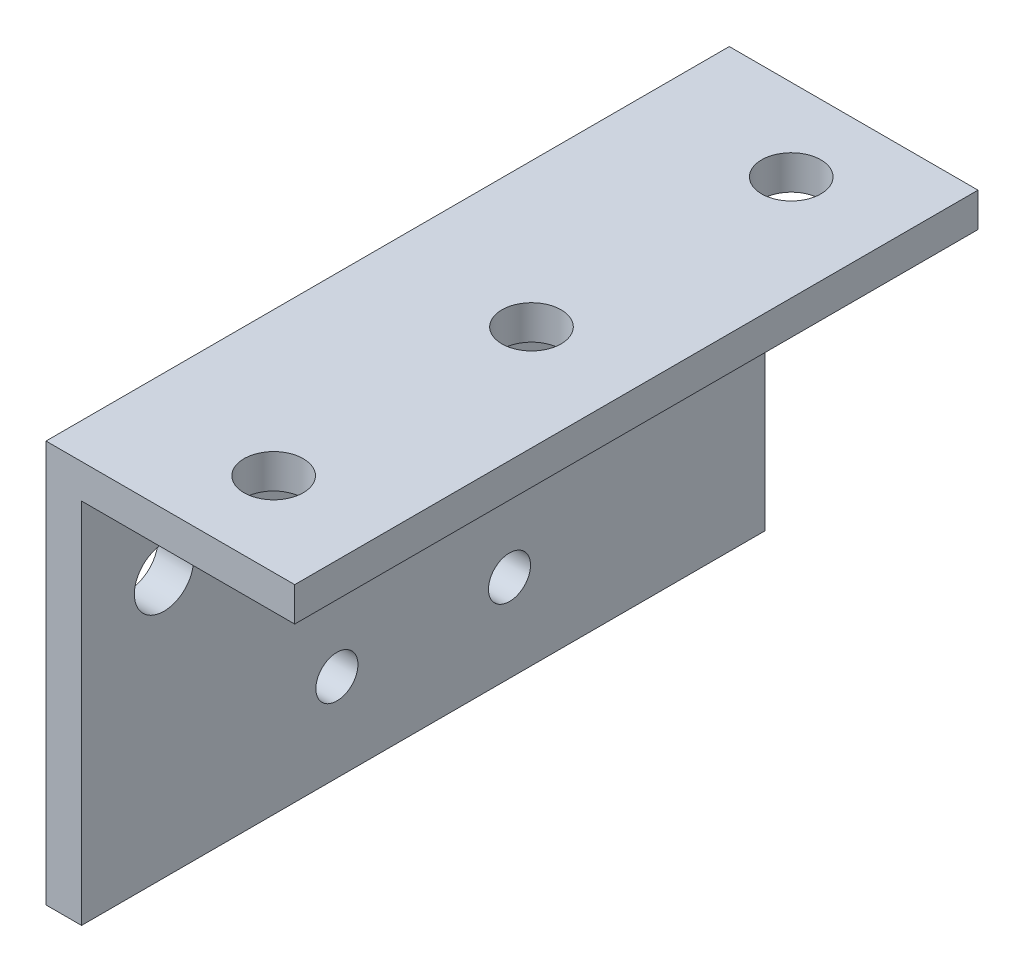
ISO-10303-21;
HEADER;
FILE_DESCRIPTION(('STEP AP214'),'2;1');
FILE_NAME('part.step','',(''),(''),'','','');
FILE_SCHEMA(('AUTOMOTIVE_DESIGN { 1 0 10303 214 1 1 1 1 }'));
ENDSEC;
DATA;
#1=APPLICATION_CONTEXT('core data for automotive mechanical design processes');
#2=APPLICATION_PROTOCOL_DEFINITION('international standard','automotive_design',2000,#1);
#3=PRODUCT_CONTEXT('',#1,'mechanical');
#4=PRODUCT('Part','Part','',(#3));
#5=PRODUCT_RELATED_PRODUCT_CATEGORY('part','',(#4));
#6=PRODUCT_DEFINITION_FORMATION('','',#4);
#7=PRODUCT_DEFINITION_CONTEXT('part definition',#1,'design');
#8=PRODUCT_DEFINITION('design','',#6,#7);
#9=PRODUCT_DEFINITION_SHAPE('','',#8);
#10=(LENGTH_UNIT() NAMED_UNIT(*) SI_UNIT(.MILLI.,.METRE.));
#11=(NAMED_UNIT(*) PLANE_ANGLE_UNIT() SI_UNIT($,.RADIAN.));
#12=(NAMED_UNIT(*) SI_UNIT($,.STERADIAN.) SOLID_ANGLE_UNIT());
#13=UNCERTAINTY_MEASURE_WITH_UNIT(LENGTH_MEASURE(1.E-05),#10,'distance_accuracy_value','');
#14=(GEOMETRIC_REPRESENTATION_CONTEXT(3) GLOBAL_UNCERTAINTY_ASSIGNED_CONTEXT((#13)) GLOBAL_UNIT_ASSIGNED_CONTEXT((#10,
#11,#12)) REPRESENTATION_CONTEXT('',''));
#15=CARTESIAN_POINT('',(0.,0.,0.));
#16=DIRECTION('',(0.,0.,1.));
#17=DIRECTION('',(1.,0.,0.));
#18=AXIS2_PLACEMENT_3D('',#15,#16,#17);
#19=CARTESIAN_POINT('',(0.,0.,63.5));
#20=DIRECTION('',(0.,1.,0.));
#21=DIRECTION('',(0.,0.,1.));
#22=AXIS2_PLACEMENT_3D('',#19,#20,#21);
#23=PLANE('',#22);
#24=DIRECTION('',(1.,0.,0.));
#25=VECTOR('',#24,1.);
#26=CARTESIAN_POINT('',(0.,0.,0.));
#27=LINE('',#26,#25);
#28=CARTESIAN_POINT('',(0.,0.,0.));
#29=VERTEX_POINT('',#28);
#30=CARTESIAN_POINT('',(3.302,0.,0.));
#31=VERTEX_POINT('',#30);
#32=EDGE_CURVE('E126',#29,#31,#27,.T.);
#33=ORIENTED_EDGE('',*,*,#32,.T.);
#34=DIRECTION('',(0.,0.,-1.));
#35=VECTOR('',#34,1.);
#36=CARTESIAN_POINT('',(3.302,0.,63.5));
#37=LINE('',#36,#35);
#38=CARTESIAN_POINT('',(3.302,0.,63.5));
#39=VERTEX_POINT('',#38);
#40=EDGE_CURVE('E11',#39,#31,#37,.T.);
#41=ORIENTED_EDGE('',*,*,#40,.F.);
#42=DIRECTION('',(1.,0.,0.));
#43=VECTOR('',#42,1.);
#44=CARTESIAN_POINT('',(0.,0.,63.5));
#45=LINE('',#44,#43);
#46=CARTESIAN_POINT('',(0.,0.,63.5));
#47=VERTEX_POINT('',#46);
#48=EDGE_CURVE('E137',#47,#39,#45,.T.);
#49=ORIENTED_EDGE('',*,*,#48,.F.);
#50=DIRECTION('',(0.,0.,-1.));
#51=VECTOR('',#50,1.);
#52=CARTESIAN_POINT('',(0.,0.,63.5));
#53=LINE('',#52,#51);
#54=EDGE_CURVE('E122',#47,#29,#53,.T.);
#55=ORIENTED_EDGE('',*,*,#54,.T.);
#56=EDGE_LOOP('',(#33,#41,#49,#55));
#57=FACE_BOUND('',#56,.T.);
#58=ADVANCED_FACE('F40',(#57),#23,.F.);
#59=CARTESIAN_POINT('',(3.302,0.,63.5));
#60=DIRECTION('',(-1.,0.,0.));
#61=DIRECTION('',(0.,0.,1.));
#62=AXIS2_PLACEMENT_3D('',#59,#60,#61);
#63=PLANE('',#62);
#64=CARTESIAN_POINT('',(3.302,8.16153330445288,39.7679614450534));
#65=DIRECTION('',(-1.,0.,0.));
#66=DIRECTION('',(0.,0.,1.));
#67=AXIS2_PLACEMENT_3D('',#64,#65,#66);
#68=CIRCLE('',#67,1.95579999999999);
#69=CARTESIAN_POINT('',(3.302,8.16153330445288,41.7237614450534));
#70=VERTEX_POINT('',#69);
#71=EDGE_CURVE('E411',#70,#70,#68,.T.);
#72=ORIENTED_EDGE('',*,*,#71,.T.);
#73=EDGE_LOOP('',(#72));
#74=FACE_BOUND('',#73,.T.);
#75=CARTESIAN_POINT('',(3.302,8.1423547735249,23.726603660302));
#76=DIRECTION('',(-1.,0.,0.));
#77=DIRECTION('',(0.,0.,1.));
#78=AXIS2_PLACEMENT_3D('',#75,#76,#77);
#79=CIRCLE('',#78,1.95579999999999);
#80=CARTESIAN_POINT('',(3.302,8.1423547735249,25.682403660302));
#81=VERTEX_POINT('',#80);
#82=EDGE_CURVE('E43',#81,#81,#79,.T.);
#83=ORIENTED_EDGE('',*,*,#82,.T.);
#84=EDGE_LOOP('',(#83));
#85=FACE_BOUND('',#84,.T.);
#86=CARTESIAN_POINT('',(3.302,24.1475733585337,23.726603660302));
#87=DIRECTION('',(-1.,0.,0.));
#88=DIRECTION('',(0.,0.,1.));
#89=AXIS2_PLACEMENT_3D('',#86,#87,#88);
#90=CIRCLE('',#89,1.95579999999999);
#91=CARTESIAN_POINT('',(3.302,24.1475733585337,25.682403660302));
#92=VERTEX_POINT('',#91);
#93=EDGE_CURVE('E401',#92,#92,#90,.T.);
#94=ORIENTED_EDGE('',*,*,#93,.T.);
#95=EDGE_LOOP('',(#94));
#96=FACE_BOUND('',#95,.T.);
#97=CARTESIAN_POINT('',(3.302,24.1475733585337,39.7207789537417));
#98=DIRECTION('',(-1.,0.,0.));
#99=DIRECTION('',(0.,0.,1.));
#100=AXIS2_PLACEMENT_3D('',#97,#98,#99);
#101=CIRCLE('',#100,1.95579999999999);
#102=CARTESIAN_POINT('',(3.302,24.1475733585337,41.6765789537417));
#103=VERTEX_POINT('',#102);
#104=EDGE_CURVE('E152',#103,#103,#101,.T.);
#105=ORIENTED_EDGE('',*,*,#104,.T.);
#106=EDGE_LOOP('',(#105));
#107=FACE_BOUND('',#106,.T.);
#108=CARTESIAN_POINT('',(3.302,24.2082215193958,7.6776384833819));
#109=DIRECTION('',(-1.,0.,0.));
#110=DIRECTION('',(0.,0.,1.));
#111=AXIS2_PLACEMENT_3D('',#108,#109,#110);
#112=CIRCLE('',#111,2.75);
#113=CARTESIAN_POINT('',(3.302,24.2082215193958,10.4276384833819));
#114=VERTEX_POINT('',#113);
#115=EDGE_CURVE('E166',#114,#114,#112,.T.);
#116=ORIENTED_EDGE('',*,*,#115,.T.);
#117=EDGE_LOOP('',(#116));
#118=FACE_BOUND('',#117,.T.);
#119=CARTESIAN_POINT('',(3.302,24.2082215193958,55.8413474799005));
#120=DIRECTION('',(-1.,0.,0.));
#121=DIRECTION('',(0.,0.,1.));
#122=AXIS2_PLACEMENT_3D('',#119,#120,#121);
#123=CIRCLE('',#122,2.75);
#124=CARTESIAN_POINT('',(3.302,24.2082215193958,58.5913474799005));
#125=VERTEX_POINT('',#124);
#126=EDGE_CURVE('E130',#125,#125,#123,.T.);
#127=ORIENTED_EDGE('',*,*,#126,.T.);
#128=EDGE_LOOP('',(#127));
#129=FACE_BOUND('',#128,.T.);
#130=DIRECTION('',(0.,1.,0.));
#131=VECTOR('',#130,1.);
#132=CARTESIAN_POINT('',(3.302,0.,0.));
#133=LINE('',#132,#131);
#134=CARTESIAN_POINT('',(3.302,34.163,0.));
#135=VERTEX_POINT('',#134);
#136=EDGE_CURVE('E129',#31,#135,#133,.T.);
#137=ORIENTED_EDGE('',*,*,#136,.T.);
#138=DIRECTION('',(0.,0.,-1.));
#139=VECTOR('',#138,1.);
#140=CARTESIAN_POINT('',(3.302,34.163,63.5));
#141=LINE('',#140,#139);
#142=CARTESIAN_POINT('',(3.302,34.163,63.5));
#143=VERTEX_POINT('',#142);
#144=EDGE_CURVE('E49',#143,#135,#141,.T.);
#145=ORIENTED_EDGE('',*,*,#144,.F.);
#146=DIRECTION('',(0.,1.,0.));
#147=VECTOR('',#146,1.);
#148=CARTESIAN_POINT('',(3.302,0.,63.5));
#149=LINE('',#148,#147);
#150=EDGE_CURVE('E95',#39,#143,#149,.T.);
#151=ORIENTED_EDGE('',*,*,#150,.F.);
#152=ORIENTED_EDGE('',*,*,#40,.T.);
#153=EDGE_LOOP('',(#137,#145,#151,#152));
#154=FACE_BOUND('',#153,.T.);
#155=ADVANCED_FACE('F177',(#74,#85,#96,#107,#118,#129,#154),#63,.F.);
#156=CARTESIAN_POINT('',(3.302,34.163,63.5));
#157=DIRECTION('',(0.,1.,0.));
#158=DIRECTION('',(0.,0.,1.));
#159=AXIS2_PLACEMENT_3D('',#156,#157,#158);
#160=PLANE('',#159);
#161=CARTESIAN_POINT('',(13.3685820866548,34.163,7.61064961564513));
#162=DIRECTION('',(0.,1.,0.));
#163=DIRECTION('',(0.,0.,1.));
#164=AXIS2_PLACEMENT_3D('',#161,#162,#163);
#165=CIRCLE('',#164,2.74999999999999);
#166=CARTESIAN_POINT('',(13.3685820866548,34.163,10.3606496156451));
#167=VERTEX_POINT('',#166);
#168=EDGE_CURVE('E416',#167,#167,#165,.T.);
#169=ORIENTED_EDGE('',*,*,#168,.T.);
#170=EDGE_LOOP('',(#169));
#171=FACE_BOUND('',#170,.T.);
#172=CARTESIAN_POINT('',(13.3685820866548,34.163,55.7136932764438));
#173=DIRECTION('',(0.,1.,0.));
#174=DIRECTION('',(0.,0.,1.));
#175=AXIS2_PLACEMENT_3D('',#172,#173,#174);
#176=CIRCLE('',#175,2.74999999999999);
#177=CARTESIAN_POINT('',(13.3685820866548,34.163,58.4636932764438));
#178=VERTEX_POINT('',#177);
#179=EDGE_CURVE('E142',#178,#178,#176,.T.);
#180=ORIENTED_EDGE('',*,*,#179,.T.);
#181=EDGE_LOOP('',(#180));
#182=FACE_BOUND('',#181,.T.);
#183=CARTESIAN_POINT('',(13.3685820866548,34.163,31.75));
#184=DIRECTION('',(0.,1.,0.));
#185=DIRECTION('',(0.,0.,1.));
#186=AXIS2_PLACEMENT_3D('',#183,#184,#185);
#187=CIRCLE('',#186,2.74999999999999);
#188=CARTESIAN_POINT('',(13.3685820866548,34.163,34.5));
#189=VERTEX_POINT('',#188);
#190=EDGE_CURVE('E149',#189,#189,#187,.T.);
#191=ORIENTED_EDGE('',*,*,#190,.T.);
#192=EDGE_LOOP('',(#191));
#193=FACE_BOUND('',#192,.T.);
#194=DIRECTION('',(1.,0.,0.));
#195=VECTOR('',#194,1.);
#196=CARTESIAN_POINT('',(3.302,34.163,0.));
#197=LINE('',#196,#195);
#198=CARTESIAN_POINT('',(23.114,34.163,0.));
#199=VERTEX_POINT('',#198);
#200=EDGE_CURVE('E132',#135,#199,#197,.T.);
#201=ORIENTED_EDGE('',*,*,#200,.T.);
#202=DIRECTION('',(0.,0.,-1.));
#203=VECTOR('',#202,1.);
#204=CARTESIAN_POINT('',(23.114,34.163,63.5));
#205=LINE('',#204,#203);
#206=CARTESIAN_POINT('',(23.114,34.163,63.5));
#207=VERTEX_POINT('',#206);
#208=EDGE_CURVE('E117',#207,#199,#205,.T.);
#209=ORIENTED_EDGE('',*,*,#208,.F.);
#210=DIRECTION('',(1.,0.,0.));
#211=VECTOR('',#210,1.);
#212=CARTESIAN_POINT('',(3.302,34.163,63.5));
#213=LINE('',#212,#211);
#214=EDGE_CURVE('E108',#143,#207,#213,.T.);
#215=ORIENTED_EDGE('',*,*,#214,.F.);
#216=ORIENTED_EDGE('',*,*,#144,.T.);
#217=EDGE_LOOP('',(#201,#209,#215,#216));
#218=FACE_BOUND('',#217,.T.);
#219=ADVANCED_FACE('F180',(#171,#182,#193,#218),#160,.F.);
#220=CARTESIAN_POINT('',(23.114,37.338,63.5));
#221=DIRECTION('',(-1.,0.,0.));
#222=DIRECTION('',(0.,-1.,0.));
#223=AXIS2_PLACEMENT_3D('',#220,#221,#222);
#224=PLANE('',#223);
#225=DIRECTION('',(0.,1.,0.));
#226=VECTOR('',#225,1.);
#227=CARTESIAN_POINT('',(23.114,37.338,0.));
#228=LINE('',#227,#226);
#229=CARTESIAN_POINT('',(23.114,37.338,0.));
#230=VERTEX_POINT('',#229);
#231=EDGE_CURVE('E116',#199,#230,#228,.T.);
#232=ORIENTED_EDGE('',*,*,#231,.T.);
#233=DIRECTION('',(0.,0.,-1.));
#234=VECTOR('',#233,1.);
#235=CARTESIAN_POINT('',(23.114,37.338,63.5));
#236=LINE('',#235,#234);
#237=CARTESIAN_POINT('',(23.114,37.338,63.5));
#238=VERTEX_POINT('',#237);
#239=EDGE_CURVE('E113',#238,#230,#236,.T.);
#240=ORIENTED_EDGE('',*,*,#239,.F.);
#241=DIRECTION('',(0.,1.,0.));
#242=VECTOR('',#241,1.);
#243=CARTESIAN_POINT('',(23.114,37.338,63.5));
#244=LINE('',#243,#242);
#245=EDGE_CURVE('E102',#207,#238,#244,.T.);
#246=ORIENTED_EDGE('',*,*,#245,.F.);
#247=ORIENTED_EDGE('',*,*,#208,.T.);
#248=EDGE_LOOP('',(#232,#240,#246,#247));
#249=FACE_BOUND('',#248,.T.);
#250=ADVANCED_FACE('F114',(#249),#224,.F.);
#251=CARTESIAN_POINT('',(0.,37.338,63.5));
#252=DIRECTION('',(0.,-1.,0.));
#253=DIRECTION('',(0.,0.,-1.));
#254=AXIS2_PLACEMENT_3D('',#251,#252,#253);
#255=PLANE('',#254);
#256=CARTESIAN_POINT('',(13.3685820866548,37.338,7.61064961564513));
#257=DIRECTION('',(0.,1.,0.));
#258=DIRECTION('',(0.,0.,1.));
#259=AXIS2_PLACEMENT_3D('',#256,#257,#258);
#260=CIRCLE('',#259,2.75);
#261=CARTESIAN_POINT('',(13.3685820866548,37.338,10.3606496156451));
#262=VERTEX_POINT('',#261);
#263=EDGE_CURVE('E419',#262,#262,#260,.T.);
#264=ORIENTED_EDGE('',*,*,#263,.F.);
#265=EDGE_LOOP('',(#264));
#266=FACE_BOUND('',#265,.T.);
#267=CARTESIAN_POINT('',(13.3685820866548,37.338,55.7136932764438));
#268=DIRECTION('',(0.,1.,0.));
#269=DIRECTION('',(0.,0.,1.));
#270=AXIS2_PLACEMENT_3D('',#267,#268,#269);
#271=CIRCLE('',#270,2.75);
#272=CARTESIAN_POINT('',(13.3685820866548,37.338,58.4636932764438));
#273=VERTEX_POINT('',#272);
#274=EDGE_CURVE('E145',#273,#273,#271,.T.);
#275=ORIENTED_EDGE('',*,*,#274,.F.);
#276=EDGE_LOOP('',(#275));
#277=FACE_BOUND('',#276,.T.);
#278=CARTESIAN_POINT('',(13.3685820866548,37.338,31.75));
#279=DIRECTION('',(0.,1.,0.));
#280=DIRECTION('',(0.,0.,1.));
#281=AXIS2_PLACEMENT_3D('',#278,#279,#280);
#282=CIRCLE('',#281,2.75);
#283=CARTESIAN_POINT('',(13.3685820866548,37.338,34.5));
#284=VERTEX_POINT('',#283);
#285=EDGE_CURVE('E144',#284,#284,#282,.T.);
#286=ORIENTED_EDGE('',*,*,#285,.F.);
#287=EDGE_LOOP('',(#286));
#288=FACE_BOUND('',#287,.T.);
#289=DIRECTION('',(-1.,0.,0.));
#290=VECTOR('',#289,1.);
#291=CARTESIAN_POINT('',(0.,37.338,0.));
#292=LINE('',#291,#290);
#293=CARTESIAN_POINT('',(0.,37.338,0.));
#294=VERTEX_POINT('',#293);
#295=EDGE_CURVE('E81',#230,#294,#292,.T.);
#296=ORIENTED_EDGE('',*,*,#295,.T.);
#297=DIRECTION('',(0.,0.,-1.));
#298=VECTOR('',#297,1.);
#299=CARTESIAN_POINT('',(0.,37.338,63.5));
#300=LINE('',#299,#298);
#301=CARTESIAN_POINT('',(0.,37.338,63.5));
#302=VERTEX_POINT('',#301);
#303=EDGE_CURVE('E118',#302,#294,#300,.T.);
#304=ORIENTED_EDGE('',*,*,#303,.F.);
#305=DIRECTION('',(-1.,0.,0.));
#306=VECTOR('',#305,1.);
#307=CARTESIAN_POINT('',(0.,37.338,63.5));
#308=LINE('',#307,#306);
#309=EDGE_CURVE('E106',#238,#302,#308,.T.);
#310=ORIENTED_EDGE('',*,*,#309,.F.);
#311=ORIENTED_EDGE('',*,*,#239,.T.);
#312=EDGE_LOOP('',(#296,#304,#310,#311));
#313=FACE_BOUND('',#312,.T.);
#314=ADVANCED_FACE('F120',(#266,#277,#288,#313),#255,.F.);
#315=CARTESIAN_POINT('',(0.,0.,63.5));
#316=DIRECTION('',(1.,0.,0.));
#317=DIRECTION('',(0.,0.,-1.));
#318=AXIS2_PLACEMENT_3D('',#315,#316,#317);
#319=PLANE('',#318);
#320=CARTESIAN_POINT('',(0.,8.16153330445288,39.7679614450534));
#321=DIRECTION('',(-1.,0.,0.));
#322=DIRECTION('',(0.,0.,1.));
#323=AXIS2_PLACEMENT_3D('',#320,#321,#322);
#324=CIRCLE('',#323,1.9558);
#325=CARTESIAN_POINT('',(0.,8.16153330445288,41.7237614450534));
#326=VERTEX_POINT('',#325);
#327=EDGE_CURVE('E413',#326,#326,#324,.T.);
#328=ORIENTED_EDGE('',*,*,#327,.F.);
#329=EDGE_LOOP('',(#328));
#330=FACE_BOUND('',#329,.T.);
#331=CARTESIAN_POINT('',(0.,8.1423547735249,23.726603660302));
#332=DIRECTION('',(-1.,0.,0.));
#333=DIRECTION('',(0.,0.,1.));
#334=AXIS2_PLACEMENT_3D('',#331,#332,#333);
#335=CIRCLE('',#334,1.9558);
#336=CARTESIAN_POINT('',(0.,8.1423547735249,25.682403660302));
#337=VERTEX_POINT('',#336);
#338=EDGE_CURVE('E408',#337,#337,#335,.T.);
#339=ORIENTED_EDGE('',*,*,#338,.F.);
#340=EDGE_LOOP('',(#339));
#341=FACE_BOUND('',#340,.T.);
#342=CARTESIAN_POINT('',(0.,24.1475733585337,23.726603660302));
#343=DIRECTION('',(-1.,0.,0.));
#344=DIRECTION('',(0.,0.,1.));
#345=AXIS2_PLACEMENT_3D('',#342,#343,#344);
#346=CIRCLE('',#345,1.95579999999999);
#347=CARTESIAN_POINT('',(0.,24.1475733585337,25.682403660302));
#348=VERTEX_POINT('',#347);
#349=EDGE_CURVE('E403',#348,#348,#346,.T.);
#350=ORIENTED_EDGE('',*,*,#349,.F.);
#351=EDGE_LOOP('',(#350));
#352=FACE_BOUND('',#351,.T.);
#353=CARTESIAN_POINT('',(0.,24.1475733585337,39.7207789537417));
#354=DIRECTION('',(-1.,0.,0.));
#355=DIRECTION('',(0.,0.,1.));
#356=AXIS2_PLACEMENT_3D('',#353,#354,#355);
#357=CIRCLE('',#356,1.95579999999999);
#358=CARTESIAN_POINT('',(0.,24.1475733585337,41.6765789537417));
#359=VERTEX_POINT('',#358);
#360=EDGE_CURVE('E157',#359,#359,#357,.T.);
#361=ORIENTED_EDGE('',*,*,#360,.F.);
#362=EDGE_LOOP('',(#361));
#363=FACE_BOUND('',#362,.T.);
#364=CARTESIAN_POINT('',(0.,24.2082215193958,7.6776384833819));
#365=DIRECTION('',(-1.,0.,0.));
#366=DIRECTION('',(0.,0.,1.));
#367=AXIS2_PLACEMENT_3D('',#364,#365,#366);
#368=CIRCLE('',#367,2.75);
#369=CARTESIAN_POINT('',(0.,24.2082215193958,10.4276384833819));
#370=VERTEX_POINT('',#369);
#371=EDGE_CURVE('E163',#370,#370,#368,.T.);
#372=ORIENTED_EDGE('',*,*,#371,.F.);
#373=EDGE_LOOP('',(#372));
#374=FACE_BOUND('',#373,.T.);
#375=CARTESIAN_POINT('',(0.,24.2082215193958,55.8413474799005));
#376=DIRECTION('',(-1.,0.,0.));
#377=DIRECTION('',(0.,0.,1.));
#378=AXIS2_PLACEMENT_3D('',#375,#376,#377);
#379=CIRCLE('',#378,2.75);
#380=CARTESIAN_POINT('',(0.,24.2082215193958,58.5913474799005));
#381=VERTEX_POINT('',#380);
#382=EDGE_CURVE('E169',#381,#381,#379,.T.);
#383=ORIENTED_EDGE('',*,*,#382,.F.);
#384=EDGE_LOOP('',(#383));
#385=FACE_BOUND('',#384,.T.);
#386=DIRECTION('',(0.,-1.,0.));
#387=VECTOR('',#386,1.);
#388=CARTESIAN_POINT('',(0.,0.,0.));
#389=LINE('',#388,#387);
#390=EDGE_CURVE('E87',#294,#29,#389,.T.);
#391=ORIENTED_EDGE('',*,*,#390,.T.);
#392=ORIENTED_EDGE('',*,*,#54,.F.);
#393=DIRECTION('',(0.,-1.,0.));
#394=VECTOR('',#393,1.);
#395=CARTESIAN_POINT('',(0.,0.,63.5));
#396=LINE('',#395,#394);
#397=EDGE_CURVE('E58',#302,#47,#396,.T.);
#398=ORIENTED_EDGE('',*,*,#397,.F.);
#399=ORIENTED_EDGE('',*,*,#303,.T.);
#400=EDGE_LOOP('',(#391,#392,#398,#399));
#401=FACE_BOUND('',#400,.T.);
#402=ADVANCED_FACE('F185',(#330,#341,#352,#363,#374,#385,#401),#319,.F.);
#403=CARTESIAN_POINT('',(0.,0.,63.5));
#404=DIRECTION('',(0.,0.,1.));
#405=DIRECTION('',(1.,0.,0.));
#406=AXIS2_PLACEMENT_3D('',#403,#404,#405);
#407=PLANE('',#406);
#408=ORIENTED_EDGE('',*,*,#48,.T.);
#409=ORIENTED_EDGE('',*,*,#150,.T.);
#410=ORIENTED_EDGE('',*,*,#214,.T.);
#411=ORIENTED_EDGE('',*,*,#245,.T.);
#412=ORIENTED_EDGE('',*,*,#309,.T.);
#413=ORIENTED_EDGE('',*,*,#397,.T.);
#414=EDGE_LOOP('',(#408,#409,#410,#411,#412,#413));
#415=FACE_BOUND('',#414,.T.);
#416=ADVANCED_FACE('F104',(#415),#407,.T.);
#417=CARTESIAN_POINT('',(0.,0.,0.));
#418=DIRECTION('',(0.,0.,1.));
#419=DIRECTION('',(1.,0.,0.));
#420=AXIS2_PLACEMENT_3D('',#417,#418,#419);
#421=PLANE('',#420);
#422=ORIENTED_EDGE('',*,*,#32,.F.);
#423=ORIENTED_EDGE('',*,*,#390,.F.);
#424=ORIENTED_EDGE('',*,*,#295,.F.);
#425=ORIENTED_EDGE('',*,*,#231,.F.);
#426=ORIENTED_EDGE('',*,*,#200,.F.);
#427=ORIENTED_EDGE('',*,*,#136,.F.);
#428=EDGE_LOOP('',(#422,#423,#424,#425,#426,#427));
#429=FACE_BOUND('',#428,.T.);
#430=ADVANCED_FACE('F183',(#429),#421,.F.);
#431=CARTESIAN_POINT('',(0.,24.2082215193958,55.8413474799005));
#432=DIRECTION('',(-1.,0.,0.));
#433=DIRECTION('',(0.,0.,1.));
#434=AXIS2_PLACEMENT_3D('',#431,#432,#433);
#435=CYLINDRICAL_SURFACE('',#434,2.75);
#436=ORIENTED_EDGE('',*,*,#382,.T.);
#437=EDGE_LOOP('',(#436));
#438=FACE_BOUND('',#437,.T.);
#439=ORIENTED_EDGE('',*,*,#126,.F.);
#440=EDGE_LOOP('',(#439));
#441=FACE_BOUND('',#440,.T.);
#442=ADVANCED_FACE('F293',(#438,#441),#435,.F.);
#443=CARTESIAN_POINT('',(0.,24.2082215193958,7.6776384833819));
#444=DIRECTION('',(-1.,0.,0.));
#445=DIRECTION('',(0.,0.,1.));
#446=AXIS2_PLACEMENT_3D('',#443,#444,#445);
#447=CYLINDRICAL_SURFACE('',#446,2.75);
#448=ORIENTED_EDGE('',*,*,#371,.T.);
#449=EDGE_LOOP('',(#448));
#450=FACE_BOUND('',#449,.T.);
#451=ORIENTED_EDGE('',*,*,#115,.F.);
#452=EDGE_LOOP('',(#451));
#453=FACE_BOUND('',#452,.T.);
#454=ADVANCED_FACE('F285',(#450,#453),#447,.F.);
#455=CARTESIAN_POINT('',(13.3685820866548,37.338,31.75));
#456=DIRECTION('',(0.,1.,0.));
#457=DIRECTION('',(0.,0.,1.));
#458=AXIS2_PLACEMENT_3D('',#455,#456,#457);
#459=CYLINDRICAL_SURFACE('',#458,2.74999999999999);
#460=ORIENTED_EDGE('',*,*,#285,.T.);
#461=EDGE_LOOP('',(#460));
#462=FACE_BOUND('',#461,.T.);
#463=ORIENTED_EDGE('',*,*,#190,.F.);
#464=EDGE_LOOP('',(#463));
#465=FACE_BOUND('',#464,.T.);
#466=ADVANCED_FACE('F278',(#462,#465),#459,.F.);
#467=CARTESIAN_POINT('',(13.3685820866548,37.338,55.7136932764438));
#468=DIRECTION('',(0.,1.,0.));
#469=DIRECTION('',(0.,0.,1.));
#470=AXIS2_PLACEMENT_3D('',#467,#468,#469);
#471=CYLINDRICAL_SURFACE('',#470,2.74999999999999);
#472=ORIENTED_EDGE('',*,*,#274,.T.);
#473=EDGE_LOOP('',(#472));
#474=FACE_BOUND('',#473,.T.);
#475=ORIENTED_EDGE('',*,*,#179,.F.);
#476=EDGE_LOOP('',(#475));
#477=FACE_BOUND('',#476,.T.);
#478=ADVANCED_FACE('F270',(#474,#477),#471,.F.);
#479=CARTESIAN_POINT('',(0.,24.1475733585337,39.7207789537417));
#480=DIRECTION('',(-1.,0.,0.));
#481=DIRECTION('',(0.,0.,1.));
#482=AXIS2_PLACEMENT_3D('',#479,#480,#481);
#483=CYLINDRICAL_SURFACE('',#482,1.95579999999999);
#484=ORIENTED_EDGE('',*,*,#360,.T.);
#485=EDGE_LOOP('',(#484));
#486=FACE_BOUND('',#485,.T.);
#487=ORIENTED_EDGE('',*,*,#104,.F.);
#488=EDGE_LOOP('',(#487));
#489=FACE_BOUND('',#488,.T.);
#490=ADVANCED_FACE('F262',(#486,#489),#483,.F.);
#491=CARTESIAN_POINT('',(0.,24.1475733585337,23.726603660302));
#492=DIRECTION('',(-1.,0.,0.));
#493=DIRECTION('',(0.,0.,1.));
#494=AXIS2_PLACEMENT_3D('',#491,#492,#493);
#495=CYLINDRICAL_SURFACE('',#494,1.95579999999999);
#496=ORIENTED_EDGE('',*,*,#349,.T.);
#497=EDGE_LOOP('',(#496));
#498=FACE_BOUND('',#497,.T.);
#499=ORIENTED_EDGE('',*,*,#93,.F.);
#500=EDGE_LOOP('',(#499));
#501=FACE_BOUND('',#500,.T.);
#502=ADVANCED_FACE('F254',(#498,#501),#495,.F.);
#503=CARTESIAN_POINT('',(0.,8.1423547735249,23.726603660302));
#504=DIRECTION('',(-1.,0.,0.));
#505=DIRECTION('',(0.,0.,1.));
#506=AXIS2_PLACEMENT_3D('',#503,#504,#505);
#507=CYLINDRICAL_SURFACE('',#506,1.95579999999999);
#508=ORIENTED_EDGE('',*,*,#338,.T.);
#509=EDGE_LOOP('',(#508));
#510=FACE_BOUND('',#509,.T.);
#511=ORIENTED_EDGE('',*,*,#82,.F.);
#512=EDGE_LOOP('',(#511));
#513=FACE_BOUND('',#512,.T.);
#514=ADVANCED_FACE('F247',(#510,#513),#507,.F.);
#515=CARTESIAN_POINT('',(0.,8.16153330445288,39.7679614450534));
#516=DIRECTION('',(-1.,0.,0.));
#517=DIRECTION('',(0.,0.,1.));
#518=AXIS2_PLACEMENT_3D('',#515,#516,#517);
#519=CYLINDRICAL_SURFACE('',#518,1.95579999999999);
#520=ORIENTED_EDGE('',*,*,#327,.T.);
#521=EDGE_LOOP('',(#520));
#522=FACE_BOUND('',#521,.T.);
#523=ORIENTED_EDGE('',*,*,#71,.F.);
#524=EDGE_LOOP('',(#523));
#525=FACE_BOUND('',#524,.T.);
#526=ADVANCED_FACE('F236',(#522,#525),#519,.F.);
#527=CARTESIAN_POINT('',(13.3685820866548,37.338,7.61064961564513));
#528=DIRECTION('',(0.,1.,0.));
#529=DIRECTION('',(0.,0.,1.));
#530=AXIS2_PLACEMENT_3D('',#527,#528,#529);
#531=CYLINDRICAL_SURFACE('',#530,2.74999999999999);
#532=ORIENTED_EDGE('',*,*,#263,.T.);
#533=EDGE_LOOP('',(#532));
#534=FACE_BOUND('',#533,.T.);
#535=ORIENTED_EDGE('',*,*,#168,.F.);
#536=EDGE_LOOP('',(#535));
#537=FACE_BOUND('',#536,.T.);
#538=ADVANCED_FACE('F232',(#534,#537),#531,.F.);
#539=CLOSED_SHELL('',(#58,#155,#219,#250,#314,#402,#416,#430,#442,#454,#466,#478,#490,#502,#514,
#526,#538));
#540=MANIFOLD_SOLID_BREP('B2',#539);
#541=ADVANCED_BREP_SHAPE_REPRESENTATION('',(#18,#540),#14);
#542=SHAPE_DEFINITION_REPRESENTATION(#9,#541);
ENDSEC;
END-ISO-10303-21;
